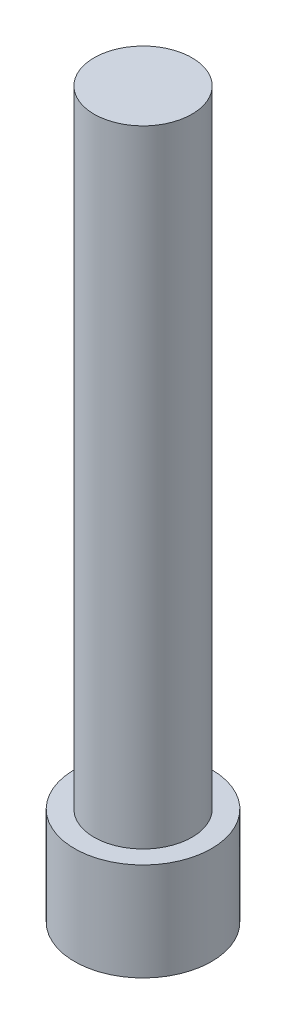
ISO-10303-21;
HEADER;
FILE_DESCRIPTION(('STEP AP214'),'2;1');
FILE_NAME('part.step','',(''),(''),'','','');
FILE_SCHEMA(('AUTOMOTIVE_DESIGN { 1 0 10303 214 1 1 1 1 }'));
ENDSEC;
DATA;
#1=APPLICATION_CONTEXT('core data for automotive mechanical design processes');
#2=APPLICATION_PROTOCOL_DEFINITION('international standard','automotive_design',2000,#1);
#3=PRODUCT_CONTEXT('',#1,'mechanical');
#4=PRODUCT('Part','Part','',(#3));
#5=PRODUCT_RELATED_PRODUCT_CATEGORY('part','',(#4));
#6=PRODUCT_DEFINITION_FORMATION('','',#4);
#7=PRODUCT_DEFINITION_CONTEXT('part definition',#1,'design');
#8=PRODUCT_DEFINITION('design','',#6,#7);
#9=PRODUCT_DEFINITION_SHAPE('','',#8);
#10=(LENGTH_UNIT() NAMED_UNIT(*) SI_UNIT(.MILLI.,.METRE.));
#11=(NAMED_UNIT(*) PLANE_ANGLE_UNIT() SI_UNIT($,.RADIAN.));
#12=(NAMED_UNIT(*) SI_UNIT($,.STERADIAN.) SOLID_ANGLE_UNIT());
#13=UNCERTAINTY_MEASURE_WITH_UNIT(LENGTH_MEASURE(1.E-05),#10,'distance_accuracy_value','');
#14=(GEOMETRIC_REPRESENTATION_CONTEXT(3) GLOBAL_UNCERTAINTY_ASSIGNED_CONTEXT((#13)) GLOBAL_UNIT_ASSIGNED_CONTEXT((#10,
#11,#12)) REPRESENTATION_CONTEXT('',''));
#15=CARTESIAN_POINT('',(0.,0.,0.));
#16=DIRECTION('',(0.,0.,1.));
#17=DIRECTION('',(1.,0.,0.));
#18=AXIS2_PLACEMENT_3D('',#15,#16,#17);
#19=CARTESIAN_POINT('',(0.,32.,0.));
#20=DIRECTION('',(0.,-1.,0.));
#21=DIRECTION('',(0.,0.,-1.));
#22=AXIS2_PLACEMENT_3D('',#19,#20,#21);
#23=CYLINDRICAL_SURFACE('',#22,2.5);
#24=CARTESIAN_POINT('',(0.,32.,0.));
#25=DIRECTION('',(0.,1.,0.));
#26=DIRECTION('',(0.,0.,1.));
#27=AXIS2_PLACEMENT_3D('',#24,#25,#26);
#28=CIRCLE('',#27,2.5);
#29=CARTESIAN_POINT('',(0.,32.,2.5));
#30=VERTEX_POINT('',#29);
#31=EDGE_CURVE('E10',#30,#30,#28,.T.);
#32=ORIENTED_EDGE('',*,*,#31,.F.);
#33=EDGE_LOOP('',(#32));
#34=FACE_BOUND('',#33,.T.);
#35=CARTESIAN_POINT('',(0.,0.,0.));
#36=DIRECTION('',(0.,1.,0.));
#37=DIRECTION('',(0.,0.,1.));
#38=AXIS2_PLACEMENT_3D('',#35,#36,#37);
#39=CIRCLE('',#38,2.5);
#40=CARTESIAN_POINT('',(0.,0.,2.5));
#41=VERTEX_POINT('',#40);
#42=EDGE_CURVE('E40',#41,#41,#39,.T.);
#43=ORIENTED_EDGE('',*,*,#42,.T.);
#44=EDGE_LOOP('',(#43));
#45=FACE_BOUND('',#44,.T.);
#46=ADVANCED_FACE('F37',(#34,#45),#23,.T.);
#47=CARTESIAN_POINT('',(0.,32.,0.));
#48=DIRECTION('',(0.,1.,0.));
#49=DIRECTION('',(0.,0.,1.));
#50=AXIS2_PLACEMENT_3D('',#47,#48,#49);
#51=PLANE('',#50);
#52=ORIENTED_EDGE('',*,*,#31,.T.);
#53=EDGE_LOOP('',(#52));
#54=FACE_BOUND('',#53,.T.);
#55=ADVANCED_FACE('F64',(#54),#51,.T.);
#56=CARTESIAN_POINT('',(0.,-5.,0.));
#57=DIRECTION('',(0.,1.,0.));
#58=DIRECTION('',(0.,0.,1.));
#59=AXIS2_PLACEMENT_3D('',#56,#57,#58);
#60=CYLINDRICAL_SURFACE('',#59,3.5);
#61=CARTESIAN_POINT('',(0.,-5.,0.));
#62=DIRECTION('',(0.,-1.,0.));
#63=DIRECTION('',(0.,0.,-1.));
#64=AXIS2_PLACEMENT_3D('',#61,#62,#63);
#65=CIRCLE('',#64,3.5);
#66=CARTESIAN_POINT('',(0.,-5.,-3.5));
#67=VERTEX_POINT('',#66);
#68=EDGE_CURVE('E49',#67,#67,#65,.T.);
#69=ORIENTED_EDGE('',*,*,#68,.F.);
#70=EDGE_LOOP('',(#69));
#71=FACE_BOUND('',#70,.T.);
#72=CARTESIAN_POINT('',(0.,0.,0.));
#73=DIRECTION('',(0.,-1.,0.));
#74=DIRECTION('',(0.,0.,-1.));
#75=AXIS2_PLACEMENT_3D('',#72,#73,#74);
#76=CIRCLE('',#75,3.5);
#77=CARTESIAN_POINT('',(0.,0.,-3.5));
#78=VERTEX_POINT('',#77);
#79=EDGE_CURVE('E51',#78,#78,#76,.T.);
#80=ORIENTED_EDGE('',*,*,#79,.T.);
#81=EDGE_LOOP('',(#80));
#82=FACE_BOUND('',#81,.T.);
#83=ADVANCED_FACE('F61',(#71,#82),#60,.T.);
#84=CARTESIAN_POINT('',(0.,-5.,0.));
#85=DIRECTION('',(0.,-1.,0.));
#86=DIRECTION('',(0.,0.,-1.));
#87=AXIS2_PLACEMENT_3D('',#84,#85,#86);
#88=PLANE('',#87);
#89=ORIENTED_EDGE('',*,*,#68,.T.);
#90=EDGE_LOOP('',(#89));
#91=FACE_BOUND('',#90,.T.);
#92=ADVANCED_FACE('F59',(#91),#88,.T.);
#93=CARTESIAN_POINT('',(0.,0.,0.));
#94=DIRECTION('',(0.,-1.,0.));
#95=DIRECTION('',(0.,0.,-1.));
#96=AXIS2_PLACEMENT_3D('',#93,#94,#95);
#97=PLANE('',#96);
#98=ORIENTED_EDGE('',*,*,#42,.F.);
#99=EDGE_LOOP('',(#98));
#100=FACE_BOUND('',#99,.T.);
#101=ORIENTED_EDGE('',*,*,#79,.F.);
#102=EDGE_LOOP('',(#101));
#103=FACE_BOUND('',#102,.T.);
#104=ADVANCED_FACE('F68',(#100,#103),#97,.F.);
#105=CLOSED_SHELL('',(#46,#55,#83,#92,#104));
#106=MANIFOLD_SOLID_BREP('B2',#105);
#107=ADVANCED_BREP_SHAPE_REPRESENTATION('',(#18,#106),#14);
#108=SHAPE_DEFINITION_REPRESENTATION(#9,#107);
ENDSEC;
END-ISO-10303-21;
